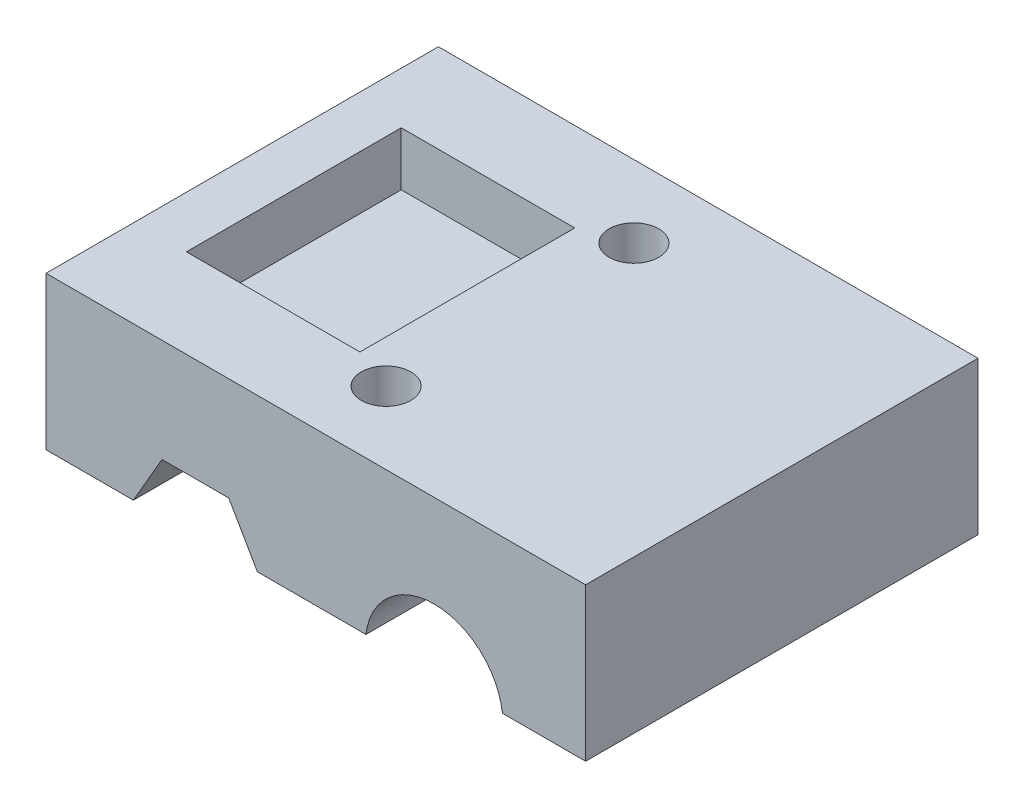
ISO-10303-21;
HEADER;
FILE_DESCRIPTION(('STEP AP214'),'2;1');
FILE_NAME('part.step','',(''),(''),'','','');
FILE_SCHEMA(('AUTOMOTIVE_DESIGN { 1 0 10303 214 1 1 1 1 }'));
ENDSEC;
DATA;
#1=APPLICATION_CONTEXT('core data for automotive mechanical design processes');
#2=APPLICATION_PROTOCOL_DEFINITION('international standard','automotive_design',2000,#1);
#3=PRODUCT_CONTEXT('',#1,'mechanical');
#4=PRODUCT('Part','Part','',(#3));
#5=PRODUCT_RELATED_PRODUCT_CATEGORY('part','',(#4));
#6=PRODUCT_DEFINITION_FORMATION('','',#4);
#7=PRODUCT_DEFINITION_CONTEXT('part definition',#1,'design');
#8=PRODUCT_DEFINITION('design','',#6,#7);
#9=PRODUCT_DEFINITION_SHAPE('','',#8);
#10=(LENGTH_UNIT() NAMED_UNIT(*) SI_UNIT(.MILLI.,.METRE.));
#11=(NAMED_UNIT(*) PLANE_ANGLE_UNIT() SI_UNIT($,.RADIAN.));
#12=(NAMED_UNIT(*) SI_UNIT($,.STERADIAN.) SOLID_ANGLE_UNIT());
#13=UNCERTAINTY_MEASURE_WITH_UNIT(LENGTH_MEASURE(1.E-05),#10,'distance_accuracy_value','');
#14=(GEOMETRIC_REPRESENTATION_CONTEXT(3) GLOBAL_UNCERTAINTY_ASSIGNED_CONTEXT((#13)) GLOBAL_UNIT_ASSIGNED_CONTEXT((#10,
#11,#12)) REPRESENTATION_CONTEXT('',''));
#15=CARTESIAN_POINT('',(0.,0.,0.));
#16=DIRECTION('',(0.,0.,1.));
#17=DIRECTION('',(1.,0.,0.));
#18=AXIS2_PLACEMENT_3D('',#15,#16,#17);
#19=CARTESIAN_POINT('',(-16.4672302289532,9.906254,12.065));
#20=DIRECTION('',(0.,-1.,0.));
#21=DIRECTION('',(0.,0.,-1.));
#22=AXIS2_PLACEMENT_3D('',#19,#20,#21);
#23=PLANE('',#22);
#24=DIRECTION('',(-1.,0.,0.));
#25=VECTOR('',#24,1.);
#26=CARTESIAN_POINT('',(-16.4672302289532,9.906254,-12.065));
#27=LINE('',#26,#25);
#28=CARTESIAN_POINT('',(16.7132,9.906254,-12.065));
#29=VERTEX_POINT('',#28);
#30=CARTESIAN_POINT('',(-16.4672302289532,9.906254,-12.065));
#31=VERTEX_POINT('',#30);
#32=EDGE_CURVE('E245',#29,#31,#27,.T.);
#33=ORIENTED_EDGE('',*,*,#32,.T.);
#34=DIRECTION('',(0.,0.,-1.));
#35=VECTOR('',#34,1.);
#36=CARTESIAN_POINT('',(-16.4672302289532,9.906254,12.065));
#37=LINE('',#36,#35);
#38=CARTESIAN_POINT('',(-16.4672302289532,9.906254,12.065));
#39=VERTEX_POINT('',#38);
#40=EDGE_CURVE('E172',#39,#31,#37,.T.);
#41=ORIENTED_EDGE('',*,*,#40,.F.);
#42=DIRECTION('',(-1.,0.,0.));
#43=VECTOR('',#42,1.);
#44=CARTESIAN_POINT('',(-16.4672302289532,9.906254,12.065));
#45=LINE('',#44,#43);
#46=CARTESIAN_POINT('',(16.7132,9.906254,12.065));
#47=VERTEX_POINT('',#46);
#48=EDGE_CURVE('E194',#47,#39,#45,.T.);
#49=ORIENTED_EDGE('',*,*,#48,.F.);
#50=DIRECTION('',(0.,0.,-1.));
#51=VECTOR('',#50,1.);
#52=CARTESIAN_POINT('',(16.7132,9.906254,12.065));
#53=LINE('',#52,#51);
#54=EDGE_CURVE('E242',#47,#29,#53,.T.);
#55=ORIENTED_EDGE('',*,*,#54,.T.);
#56=EDGE_LOOP('',(#33,#41,#49,#55));
#57=FACE_BOUND('',#56,.T.);
#58=CARTESIAN_POINT('',(0.,9.906254,-7.62));
#59=DIRECTION('',(0.,1.,0.));
#60=DIRECTION('',(0.,0.,1.));
#61=AXIS2_PLACEMENT_3D('',#58,#59,#60);
#62=CIRCLE('',#61,1.524);
#63=CARTESIAN_POINT('',(0.,9.906254,-6.096));
#64=VERTEX_POINT('',#63);
#65=EDGE_CURVE('E186',#64,#64,#62,.T.);
#66=ORIENTED_EDGE('',*,*,#65,.F.);
#67=EDGE_LOOP('',(#66));
#68=FACE_BOUND('',#67,.T.);
#69=CARTESIAN_POINT('',(0.,9.906254,7.62));
#70=DIRECTION('',(0.,1.,0.));
#71=DIRECTION('',(0.,0.,1.));
#72=AXIS2_PLACEMENT_3D('',#69,#70,#71);
#73=CIRCLE('',#72,1.524);
#74=CARTESIAN_POINT('',(0.,9.906254,9.144));
#75=VERTEX_POINT('',#74);
#76=EDGE_CURVE('E170',#75,#75,#73,.T.);
#77=ORIENTED_EDGE('',*,*,#76,.F.);
#78=EDGE_LOOP('',(#77));
#79=FACE_BOUND('',#78,.T.);
#80=DIRECTION('',(1.,0.,0.));
#81=VECTOR('',#80,1.);
#82=CARTESIAN_POINT('',(-16.4672302289532,9.906254,-6.604));
#83=LINE('',#82,#81);
#84=CARTESIAN_POINT('',(-13.2922302289532,9.906254,-6.604));
#85=VERTEX_POINT('',#84);
#86=CARTESIAN_POINT('',(-2.62423022895324,9.906254,-6.604));
#87=VERTEX_POINT('',#86);
#88=EDGE_CURVE('E239',#85,#87,#83,.T.);
#89=ORIENTED_EDGE('',*,*,#88,.T.);
#90=DIRECTION('',(0.,0.,-1.));
#91=VECTOR('',#90,1.);
#92=CARTESIAN_POINT('',(-2.62423022895324,9.906254,12.065));
#93=LINE('',#92,#91);
#94=CARTESIAN_POINT('',(-2.62423022895324,9.906254,6.604));
#95=VERTEX_POINT('',#94);
#96=EDGE_CURVE('E146',#95,#87,#93,.T.);
#97=ORIENTED_EDGE('',*,*,#96,.F.);
#98=DIRECTION('',(1.,0.,0.));
#99=VECTOR('',#98,1.);
#100=CARTESIAN_POINT('',(-16.4672302289532,9.906254,6.604));
#101=LINE('',#100,#99);
#102=CARTESIAN_POINT('',(-13.2922302289532,9.906254,6.604));
#103=VERTEX_POINT('',#102);
#104=EDGE_CURVE('E142',#103,#95,#101,.T.);
#105=ORIENTED_EDGE('',*,*,#104,.F.);
#106=DIRECTION('',(0.,0.,-1.));
#107=VECTOR('',#106,1.);
#108=CARTESIAN_POINT('',(-13.2922302289532,9.906254,12.065));
#109=LINE('',#108,#107);
#110=EDGE_CURVE('E195',#103,#85,#109,.T.);
#111=ORIENTED_EDGE('',*,*,#110,.T.);
#112=EDGE_LOOP('',(#89,#97,#105,#111));
#113=FACE_BOUND('',#112,.T.);
#114=ADVANCED_FACE('F32',(#57,#68,#79,#113),#23,.F.);
#115=CARTESIAN_POINT('',(0.,0.,12.065));
#116=DIRECTION('',(0.,0.,1.));
#117=DIRECTION('',(1.,0.,0.));
#118=AXIS2_PLACEMENT_3D('',#115,#116,#117);
#119=PLANE('',#118);
#120=DIRECTION('',(-1.,0.,0.));
#121=VECTOR('',#120,1.);
#122=CARTESIAN_POINT('',(-19.05,0.508,12.065));
#123=LINE('',#122,#121);
#124=CARTESIAN_POINT('',(16.7132,0.508,12.065));
#125=VERTEX_POINT('',#124);
#126=CARTESIAN_POINT('',(11.6026093556504,0.508,12.065));
#127=VERTEX_POINT('',#126);
#128=EDGE_CURVE('E45',#125,#127,#123,.T.);
#129=ORIENTED_EDGE('',*,*,#128,.F.);
#130=DIRECTION('',(0.,1.,0.));
#131=VECTOR('',#130,1.);
#132=CARTESIAN_POINT('',(16.7132,9.906254,12.065));
#133=LINE('',#132,#131);
#134=EDGE_CURVE('E192',#125,#47,#133,.T.);
#135=ORIENTED_EDGE('',*,*,#134,.T.);
#136=ORIENTED_EDGE('',*,*,#48,.T.);
#137=DIRECTION('',(0.,-1.,0.));
#138=VECTOR('',#137,1.);
#139=CARTESIAN_POINT('',(-16.4672302289532,9.906254,12.065));
#140=LINE('',#139,#138);
#141=CARTESIAN_POINT('',(-16.4672302289532,0.508,12.065));
#142=VERTEX_POINT('',#141);
#143=EDGE_CURVE('E196',#39,#142,#140,.T.);
#144=ORIENTED_EDGE('',*,*,#143,.T.);
#145=CARTESIAN_POINT('',(-11.0940829391733,0.507999999999999,12.065));
#146=VERTEX_POINT('',#145);
#147=EDGE_CURVE('E11',#146,#142,#123,.T.);
#148=ORIENTED_EDGE('',*,*,#147,.F.);
#149=DIRECTION('',(-0.5,-0.866025403784439,0.));
#150=VECTOR('',#149,1.);
#151=CARTESIAN_POINT('',(-9.33417267171493,3.556254,12.065));
#152=LINE('',#151,#150);
#153=CARTESIAN_POINT('',(-9.33417267171493,3.556254,12.065));
#154=VERTEX_POINT('',#153);
#155=EDGE_CURVE('E200',#154,#146,#152,.T.);
#156=ORIENTED_EDGE('',*,*,#155,.F.);
#157=DIRECTION('',(-1.,0.,0.));
#158=VECTOR('',#157,1.);
#159=CARTESIAN_POINT('',(-5.22805755723831,3.556254,12.065));
#160=LINE('',#159,#158);
#161=CARTESIAN_POINT('',(-5.22805755723831,3.556254,12.065));
#162=VERTEX_POINT('',#161);
#163=EDGE_CURVE('E208',#162,#154,#160,.T.);
#164=ORIENTED_EDGE('',*,*,#163,.F.);
#165=DIRECTION('',(-0.5,0.866025403784439,0.));
#166=VECTOR('',#165,1.);
#167=CARTESIAN_POINT('',(-3.175,0.000254000000000001,12.065));
#168=LINE('',#167,#166);
#169=CARTESIAN_POINT('',(-3.46814728977996,0.508000000000002,12.065));
#170=VERTEX_POINT('',#169);
#171=EDGE_CURVE('E225',#170,#162,#168,.T.);
#172=ORIENTED_EDGE('',*,*,#171,.F.);
#173=CARTESIAN_POINT('',(3.20559064434959,0.508,12.065));
#174=VERTEX_POINT('',#173);
#175=EDGE_CURVE('E44',#174,#170,#123,.T.);
#176=ORIENTED_EDGE('',*,*,#175,.F.);
#177=CARTESIAN_POINT('',(7.4041,0.000254,12.065));
#178=DIRECTION('',(0.,0.,1.));
#179=DIRECTION('',(1.,0.,0.));
#180=AXIS2_PLACEMENT_3D('',#177,#178,#179);
#181=CIRCLE('',#180,4.2291);
#182=EDGE_CURVE('E187',#127,#174,#181,.T.);
#183=ORIENTED_EDGE('',*,*,#182,.F.);
#184=EDGE_LOOP('',(#129,#135,#136,#144,#148,#156,#164,#172,#176,#183));
#185=FACE_BOUND('',#184,.T.);
#186=ADVANCED_FACE('F258',(#185),#119,.T.);
#187=CARTESIAN_POINT('',(0.,0.,-12.065));
#188=DIRECTION('',(0.,0.,1.));
#189=DIRECTION('',(1.,0.,0.));
#190=AXIS2_PLACEMENT_3D('',#187,#188,#189);
#191=PLANE('',#190);
#192=DIRECTION('',(0.,1.,0.));
#193=VECTOR('',#192,1.);
#194=CARTESIAN_POINT('',(16.7132,9.906254,-12.065));
#195=LINE('',#194,#193);
#196=CARTESIAN_POINT('',(16.7132,0.508,-12.065));
#197=VERTEX_POINT('',#196);
#198=EDGE_CURVE('E177',#197,#29,#195,.T.);
#199=ORIENTED_EDGE('',*,*,#198,.F.);
#200=DIRECTION('',(-1.,0.,0.));
#201=VECTOR('',#200,1.);
#202=CARTESIAN_POINT('',(-19.05,0.508,-12.065));
#203=LINE('',#202,#201);
#204=CARTESIAN_POINT('',(11.6026093556504,0.508,-12.065));
#205=VERTEX_POINT('',#204);
#206=EDGE_CURVE('E190',#197,#205,#203,.T.);
#207=ORIENTED_EDGE('',*,*,#206,.T.);
#208=CARTESIAN_POINT('',(7.4041,0.000254,-12.065));
#209=DIRECTION('',(0.,0.,1.));
#210=DIRECTION('',(1.,0.,0.));
#211=AXIS2_PLACEMENT_3D('',#208,#209,#210);
#212=CIRCLE('',#211,4.2291);
#213=CARTESIAN_POINT('',(3.20559064434959,0.508,-12.065));
#214=VERTEX_POINT('',#213);
#215=EDGE_CURVE('E36',#205,#214,#212,.T.);
#216=ORIENTED_EDGE('',*,*,#215,.T.);
#217=CARTESIAN_POINT('',(-3.46814728977996,0.508000000000002,-12.065));
#218=VERTEX_POINT('',#217);
#219=EDGE_CURVE('E86',#214,#218,#203,.T.);
#220=ORIENTED_EDGE('',*,*,#219,.T.);
#221=DIRECTION('',(-0.5,0.866025403784439,0.));
#222=VECTOR('',#221,1.);
#223=CARTESIAN_POINT('',(-3.175,0.000254000000000001,-12.065));
#224=LINE('',#223,#222);
#225=CARTESIAN_POINT('',(-5.22805755723831,3.556254,-12.065));
#226=VERTEX_POINT('',#225);
#227=EDGE_CURVE('E221',#218,#226,#224,.T.);
#228=ORIENTED_EDGE('',*,*,#227,.T.);
#229=DIRECTION('',(-1.,0.,0.));
#230=VECTOR('',#229,1.);
#231=CARTESIAN_POINT('',(-5.22805755723831,3.556254,-12.065));
#232=LINE('',#231,#230);
#233=CARTESIAN_POINT('',(-9.33417267171493,3.556254,-12.065));
#234=VERTEX_POINT('',#233);
#235=EDGE_CURVE('E219',#226,#234,#232,.T.);
#236=ORIENTED_EDGE('',*,*,#235,.T.);
#237=DIRECTION('',(-0.5,-0.866025403784439,0.));
#238=VECTOR('',#237,1.);
#239=CARTESIAN_POINT('',(-9.33417267171493,3.556254,-12.065));
#240=LINE('',#239,#238);
#241=CARTESIAN_POINT('',(-11.0940829391733,0.508,-12.065));
#242=VERTEX_POINT('',#241);
#243=EDGE_CURVE('E189',#234,#242,#240,.T.);
#244=ORIENTED_EDGE('',*,*,#243,.T.);
#245=CARTESIAN_POINT('',(-16.4672302289532,0.508,-12.065));
#246=VERTEX_POINT('',#245);
#247=EDGE_CURVE('E188',#242,#246,#203,.T.);
#248=ORIENTED_EDGE('',*,*,#247,.T.);
#249=DIRECTION('',(0.,-1.,0.));
#250=VECTOR('',#249,1.);
#251=CARTESIAN_POINT('',(-16.4672302289532,9.906254,-12.065));
#252=LINE('',#251,#250);
#253=EDGE_CURVE('E173',#31,#246,#252,.T.);
#254=ORIENTED_EDGE('',*,*,#253,.F.);
#255=ORIENTED_EDGE('',*,*,#32,.F.);
#256=EDGE_LOOP('',(#199,#207,#216,#220,#228,#236,#244,#248,#254,#255));
#257=FACE_BOUND('',#256,.T.);
#258=ADVANCED_FACE('F268',(#257),#191,.F.);
#259=CARTESIAN_POINT('',(-16.4672302289532,9.906254,12.065));
#260=DIRECTION('',(1.,0.,0.));
#261=DIRECTION('',(0.,1.,0.));
#262=AXIS2_PLACEMENT_3D('',#259,#260,#261);
#263=PLANE('',#262);
#264=ORIENTED_EDGE('',*,*,#253,.T.);
#265=DIRECTION('',(0.,0.,1.));
#266=VECTOR('',#265,1.);
#267=CARTESIAN_POINT('',(-16.4672302289532,0.508000000000002,12.065));
#268=LINE('',#267,#266);
#269=EDGE_CURVE('E52',#246,#142,#268,.T.);
#270=ORIENTED_EDGE('',*,*,#269,.T.);
#271=ORIENTED_EDGE('',*,*,#143,.F.);
#272=ORIENTED_EDGE('',*,*,#40,.T.);
#273=EDGE_LOOP('',(#264,#270,#271,#272));
#274=FACE_BOUND('',#273,.T.);
#275=ADVANCED_FACE('F265',(#274),#263,.F.);
#276=CARTESIAN_POINT('',(16.7132,9.906254,12.065));
#277=DIRECTION('',(-1.,0.,0.));
#278=DIRECTION('',(0.,-1.,0.));
#279=AXIS2_PLACEMENT_3D('',#276,#277,#278);
#280=PLANE('',#279);
#281=ORIENTED_EDGE('',*,*,#134,.F.);
#282=DIRECTION('',(0.,0.,-1.));
#283=VECTOR('',#282,1.);
#284=CARTESIAN_POINT('',(16.7132,0.508000000000002,12.065));
#285=LINE('',#284,#283);
#286=EDGE_CURVE('E174',#125,#197,#285,.T.);
#287=ORIENTED_EDGE('',*,*,#286,.T.);
#288=ORIENTED_EDGE('',*,*,#198,.T.);
#289=ORIENTED_EDGE('',*,*,#54,.F.);
#290=EDGE_LOOP('',(#281,#287,#288,#289));
#291=FACE_BOUND('',#290,.T.);
#292=ADVANCED_FACE('F293',(#291),#280,.F.);
#293=CARTESIAN_POINT('',(-9.33417267171493,3.556254,12.065));
#294=DIRECTION('',(0.866025403784438,-0.5,0.));
#295=DIRECTION('',(0.5,0.866025403784439,0.));
#296=AXIS2_PLACEMENT_3D('',#293,#294,#295);
#297=PLANE('',#296);
#298=DIRECTION('',(0.,0.,1.));
#299=VECTOR('',#298,1.);
#300=CARTESIAN_POINT('',(-11.0940829391733,0.508,12.065));
#301=LINE('',#300,#299);
#302=EDGE_CURVE('E42',#242,#146,#301,.T.);
#303=ORIENTED_EDGE('',*,*,#302,.F.);
#304=ORIENTED_EDGE('',*,*,#243,.F.);
#305=DIRECTION('',(0.,0.,-1.));
#306=VECTOR('',#305,1.);
#307=CARTESIAN_POINT('',(-9.33417267171493,3.556254,12.065));
#308=LINE('',#307,#306);
#309=EDGE_CURVE('E203',#154,#234,#308,.T.);
#310=ORIENTED_EDGE('',*,*,#309,.F.);
#311=ORIENTED_EDGE('',*,*,#155,.T.);
#312=EDGE_LOOP('',(#303,#304,#310,#311));
#313=FACE_BOUND('',#312,.T.);
#314=ADVANCED_FACE('F272',(#313),#297,.T.);
#315=CARTESIAN_POINT('',(-3.175,0.000254000000000001,12.065));
#316=DIRECTION('',(-0.866025403784439,-0.5,0.));
#317=DIRECTION('',(0.5,-0.866025403784439,0.));
#318=AXIS2_PLACEMENT_3D('',#315,#316,#317);
#319=PLANE('',#318);
#320=DIRECTION('',(0.,0.,-1.));
#321=VECTOR('',#320,1.);
#322=CARTESIAN_POINT('',(-3.46814728977996,0.508,12.065));
#323=LINE('',#322,#321);
#324=EDGE_CURVE('E155',#170,#218,#323,.T.);
#325=ORIENTED_EDGE('',*,*,#324,.F.);
#326=ORIENTED_EDGE('',*,*,#171,.T.);
#327=DIRECTION('',(0.,0.,-1.));
#328=VECTOR('',#327,1.);
#329=CARTESIAN_POINT('',(-5.22805755723831,3.556254,12.065));
#330=LINE('',#329,#328);
#331=EDGE_CURVE('E214',#162,#226,#330,.T.);
#332=ORIENTED_EDGE('',*,*,#331,.T.);
#333=ORIENTED_EDGE('',*,*,#227,.F.);
#334=EDGE_LOOP('',(#325,#326,#332,#333));
#335=FACE_BOUND('',#334,.T.);
#336=ADVANCED_FACE('F282',(#335),#319,.T.);
#337=CARTESIAN_POINT('',(-5.22805755723831,3.556254,12.065));
#338=DIRECTION('',(0.,-1.,0.));
#339=DIRECTION('',(1.,0.,0.));
#340=AXIS2_PLACEMENT_3D('',#337,#338,#339);
#341=PLANE('',#340);
#342=ORIENTED_EDGE('',*,*,#235,.F.);
#343=ORIENTED_EDGE('',*,*,#331,.F.);
#344=ORIENTED_EDGE('',*,*,#163,.T.);
#345=ORIENTED_EDGE('',*,*,#309,.T.);
#346=EDGE_LOOP('',(#342,#343,#344,#345));
#347=FACE_BOUND('',#346,.T.);
#348=ADVANCED_FACE('F277',(#347),#341,.T.);
#349=CARTESIAN_POINT('',(7.4041,0.000254,12.065));
#350=DIRECTION('',(0.,0.,-1.));
#351=DIRECTION('',(-1.,0.,0.));
#352=AXIS2_PLACEMENT_3D('',#349,#350,#351);
#353=CYLINDRICAL_SURFACE('',#352,4.2291);
#354=DIRECTION('',(0.,0.,-1.));
#355=VECTOR('',#354,1.);
#356=CARTESIAN_POINT('',(11.6026093556504,0.508,12.065));
#357=LINE('',#356,#355);
#358=EDGE_CURVE('E179',#127,#205,#357,.T.);
#359=ORIENTED_EDGE('',*,*,#358,.F.);
#360=ORIENTED_EDGE('',*,*,#182,.T.);
#361=DIRECTION('',(0.,0.,-1.));
#362=VECTOR('',#361,1.);
#363=CARTESIAN_POINT('',(3.20559064434959,0.508,12.065));
#364=LINE('',#363,#362);
#365=EDGE_CURVE('E82',#214,#174,#364,.F.);
#366=ORIENTED_EDGE('',*,*,#365,.F.);
#367=ORIENTED_EDGE('',*,*,#215,.F.);
#368=EDGE_LOOP('',(#359,#360,#366,#367));
#369=FACE_BOUND('',#368,.T.);
#370=ADVANCED_FACE('F290',(#369),#353,.F.);
#371=CARTESIAN_POINT('',(0.,-9.905746,-7.62));
#372=DIRECTION('',(0.,1.,0.));
#373=DIRECTION('',(0.,0.,1.));
#374=AXIS2_PLACEMENT_3D('',#371,#372,#373);
#375=CYLINDRICAL_SURFACE('',#374,1.524);
#376=CARTESIAN_POINT('',(0.,0.508,-7.62));
#377=DIRECTION('',(0.,1.,0.));
#378=DIRECTION('',(0.,0.,1.));
#379=AXIS2_PLACEMENT_3D('',#376,#377,#378);
#380=CIRCLE('',#379,1.524);
#381=CARTESIAN_POINT('',(0.,0.508,-6.096));
#382=VERTEX_POINT('',#381);
#383=EDGE_CURVE('E183',#382,#382,#380,.F.);
#384=ORIENTED_EDGE('',*,*,#383,.T.);
#385=EDGE_LOOP('',(#384));
#386=FACE_BOUND('',#385,.T.);
#387=ORIENTED_EDGE('',*,*,#65,.T.);
#388=EDGE_LOOP('',(#387));
#389=FACE_BOUND('',#388,.T.);
#390=ADVANCED_FACE('F416',(#386,#389),#375,.F.);
#391=CARTESIAN_POINT('',(0.,-9.905746,7.62));
#392=DIRECTION('',(0.,1.,0.));
#393=DIRECTION('',(0.,0.,1.));
#394=AXIS2_PLACEMENT_3D('',#391,#392,#393);
#395=CYLINDRICAL_SURFACE('',#394,1.524);
#396=CARTESIAN_POINT('',(0.,0.508,7.62));
#397=DIRECTION('',(0.,1.,0.));
#398=DIRECTION('',(0.,0.,1.));
#399=AXIS2_PLACEMENT_3D('',#396,#397,#398);
#400=CIRCLE('',#399,1.524);
#401=CARTESIAN_POINT('',(0.,0.508,9.144));
#402=VERTEX_POINT('',#401);
#403=EDGE_CURVE('E231',#402,#402,#400,.F.);
#404=ORIENTED_EDGE('',*,*,#403,.T.);
#405=EDGE_LOOP('',(#404));
#406=FACE_BOUND('',#405,.T.);
#407=ORIENTED_EDGE('',*,*,#76,.T.);
#408=EDGE_LOOP('',(#407));
#409=FACE_BOUND('',#408,.T.);
#410=ADVANCED_FACE('F34',(#406,#409),#395,.F.);
#411=CARTESIAN_POINT('',(-16.4672302289532,6.604254,-6.604));
#412=DIRECTION('',(0.,0.,1.));
#413=DIRECTION('',(1.,0.,0.));
#414=AXIS2_PLACEMENT_3D('',#411,#412,#413);
#415=PLANE('',#414);
#416=ORIENTED_EDGE('',*,*,#88,.F.);
#417=DIRECTION('',(0.,1.,0.));
#418=VECTOR('',#417,1.);
#419=CARTESIAN_POINT('',(-13.2922302289532,6.604254,-6.604));
#420=LINE('',#419,#418);
#421=CARTESIAN_POINT('',(-13.2922302289532,6.604254,-6.604));
#422=VERTEX_POINT('',#421);
#423=EDGE_CURVE('E160',#422,#85,#420,.T.);
#424=ORIENTED_EDGE('',*,*,#423,.F.);
#425=DIRECTION('',(1.,0.,0.));
#426=VECTOR('',#425,1.);
#427=CARTESIAN_POINT('',(-16.4672302289532,6.604254,-6.604));
#428=LINE('',#427,#426);
#429=CARTESIAN_POINT('',(-2.62423022895324,6.604254,-6.604));
#430=VERTEX_POINT('',#429);
#431=EDGE_CURVE('E167',#422,#430,#428,.T.);
#432=ORIENTED_EDGE('',*,*,#431,.T.);
#433=DIRECTION('',(0.,1.,0.));
#434=VECTOR('',#433,1.);
#435=CARTESIAN_POINT('',(-2.62423022895324,6.604254,-6.604));
#436=LINE('',#435,#434);
#437=EDGE_CURVE('E152',#430,#87,#436,.T.);
#438=ORIENTED_EDGE('',*,*,#437,.T.);
#439=EDGE_LOOP('',(#416,#424,#432,#438));
#440=FACE_BOUND('',#439,.T.);
#441=ADVANCED_FACE('F315',(#440),#415,.T.);
#442=CARTESIAN_POINT('',(-2.62423022895324,6.604254,12.065));
#443=DIRECTION('',(1.,0.,0.));
#444=DIRECTION('',(0.,0.,-1.));
#445=AXIS2_PLACEMENT_3D('',#442,#443,#444);
#446=PLANE('',#445);
#447=ORIENTED_EDGE('',*,*,#96,.T.);
#448=ORIENTED_EDGE('',*,*,#437,.F.);
#449=DIRECTION('',(0.,0.,-1.));
#450=VECTOR('',#449,1.);
#451=CARTESIAN_POINT('',(-2.62423022895324,6.604254,12.065));
#452=LINE('',#451,#450);
#453=CARTESIAN_POINT('',(-2.62423022895324,6.604254,6.604));
#454=VERTEX_POINT('',#453);
#455=EDGE_CURVE('E150',#454,#430,#452,.T.);
#456=ORIENTED_EDGE('',*,*,#455,.F.);
#457=DIRECTION('',(0.,1.,0.));
#458=VECTOR('',#457,1.);
#459=CARTESIAN_POINT('',(-2.62423022895324,6.604254,6.604));
#460=LINE('',#459,#458);
#461=EDGE_CURVE('E136',#454,#95,#460,.T.);
#462=ORIENTED_EDGE('',*,*,#461,.T.);
#463=EDGE_LOOP('',(#447,#448,#456,#462));
#464=FACE_BOUND('',#463,.T.);
#465=ADVANCED_FACE('F151',(#464),#446,.F.);
#466=CARTESIAN_POINT('',(-16.4672302289532,6.604254,6.604));
#467=DIRECTION('',(0.,0.,1.));
#468=DIRECTION('',(1.,0.,0.));
#469=AXIS2_PLACEMENT_3D('',#466,#467,#468);
#470=PLANE('',#469);
#471=ORIENTED_EDGE('',*,*,#104,.T.);
#472=ORIENTED_EDGE('',*,*,#461,.F.);
#473=DIRECTION('',(1.,0.,0.));
#474=VECTOR('',#473,1.);
#475=CARTESIAN_POINT('',(-16.4672302289532,6.604254,6.604));
#476=LINE('',#475,#474);
#477=CARTESIAN_POINT('',(-13.2922302289532,6.604254,6.604));
#478=VERTEX_POINT('',#477);
#479=EDGE_CURVE('E140',#478,#454,#476,.T.);
#480=ORIENTED_EDGE('',*,*,#479,.F.);
#481=DIRECTION('',(0.,1.,0.));
#482=VECTOR('',#481,1.);
#483=CARTESIAN_POINT('',(-13.2922302289532,6.604254,6.604));
#484=LINE('',#483,#482);
#485=EDGE_CURVE('E235',#478,#103,#484,.T.);
#486=ORIENTED_EDGE('',*,*,#485,.T.);
#487=EDGE_LOOP('',(#471,#472,#480,#486));
#488=FACE_BOUND('',#487,.T.);
#489=ADVANCED_FACE('F138',(#488),#470,.F.);
#490=CARTESIAN_POINT('',(-13.2922302289532,6.604254,12.065));
#491=DIRECTION('',(1.,0.,0.));
#492=DIRECTION('',(0.,0.,-1.));
#493=AXIS2_PLACEMENT_3D('',#490,#491,#492);
#494=PLANE('',#493);
#495=ORIENTED_EDGE('',*,*,#110,.F.);
#496=ORIENTED_EDGE('',*,*,#485,.F.);
#497=DIRECTION('',(0.,0.,-1.));
#498=VECTOR('',#497,1.);
#499=CARTESIAN_POINT('',(-13.2922302289532,6.604254,12.065));
#500=LINE('',#499,#498);
#501=EDGE_CURVE('E159',#478,#422,#500,.T.);
#502=ORIENTED_EDGE('',*,*,#501,.T.);
#503=ORIENTED_EDGE('',*,*,#423,.T.);
#504=EDGE_LOOP('',(#495,#496,#502,#503));
#505=FACE_BOUND('',#504,.T.);
#506=ADVANCED_FACE('F323',(#505),#494,.T.);
#507=CARTESIAN_POINT('',(0.,6.604254,0.));
#508=DIRECTION('',(0.,1.,0.));
#509=DIRECTION('',(0.,0.,1.));
#510=AXIS2_PLACEMENT_3D('',#507,#508,#509);
#511=PLANE('',#510);
#512=ORIENTED_EDGE('',*,*,#431,.F.);
#513=ORIENTED_EDGE('',*,*,#501,.F.);
#514=ORIENTED_EDGE('',*,*,#479,.T.);
#515=ORIENTED_EDGE('',*,*,#455,.T.);
#516=EDGE_LOOP('',(#512,#513,#514,#515));
#517=FACE_BOUND('',#516,.T.);
#518=ADVANCED_FACE('F158',(#517),#511,.T.);
#519=CARTESIAN_POINT('',(-19.05,0.508,-12.065));
#520=DIRECTION('',(0.,1.,0.));
#521=DIRECTION('',(0.,0.,1.));
#522=AXIS2_PLACEMENT_3D('',#519,#520,#521);
#523=PLANE('',#522);
#524=ORIENTED_EDGE('',*,*,#324,.T.);
#525=ORIENTED_EDGE('',*,*,#219,.F.);
#526=ORIENTED_EDGE('',*,*,#365,.T.);
#527=ORIENTED_EDGE('',*,*,#175,.T.);
#528=EDGE_LOOP('',(#524,#525,#526,#527));
#529=FACE_BOUND('',#528,.T.);
#530=ORIENTED_EDGE('',*,*,#403,.F.);
#531=EDGE_LOOP('',(#530));
#532=FACE_BOUND('',#531,.T.);
#533=ORIENTED_EDGE('',*,*,#383,.F.);
#534=EDGE_LOOP('',(#533));
#535=FACE_BOUND('',#534,.T.);
#536=ADVANCED_FACE('F283',(#529,#532,#535),#523,.F.);
#537=ORIENTED_EDGE('',*,*,#128,.T.);
#538=ORIENTED_EDGE('',*,*,#358,.T.);
#539=ORIENTED_EDGE('',*,*,#206,.F.);
#540=ORIENTED_EDGE('',*,*,#286,.F.);
#541=EDGE_LOOP('',(#537,#538,#539,#540));
#542=FACE_BOUND('',#541,.T.);
#543=ADVANCED_FACE('F291',(#542),#523,.F.);
#544=ORIENTED_EDGE('',*,*,#247,.F.);
#545=ORIENTED_EDGE('',*,*,#302,.T.);
#546=ORIENTED_EDGE('',*,*,#147,.T.);
#547=ORIENTED_EDGE('',*,*,#269,.F.);
#548=EDGE_LOOP('',(#544,#545,#546,#547));
#549=FACE_BOUND('',#548,.T.);
#550=ADVANCED_FACE('F270',(#549),#523,.F.);
#551=CLOSED_SHELL('',(#114,#186,#258,#275,#292,#314,#336,#348,#370,#390,#410,#441,#465,#489,
#506,#518,#536,#543,#550));
#552=MANIFOLD_SOLID_BREP('B2',#551);
#553=ADVANCED_BREP_SHAPE_REPRESENTATION('',(#18,#552),#14);
#554=SHAPE_DEFINITION_REPRESENTATION(#9,#553);
ENDSEC;
END-ISO-10303-21;
